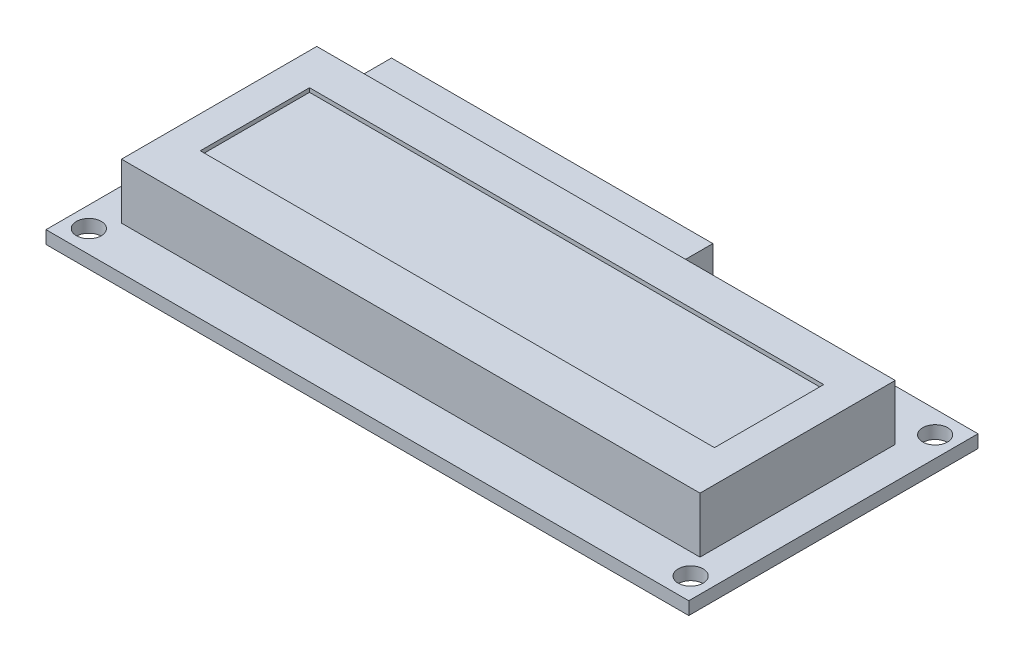
ISO-10303-21;
HEADER;
FILE_DESCRIPTION(('STEP AP214'),'2;1');
FILE_NAME('part.step','',(''),(''),'','','');
FILE_SCHEMA(('AUTOMOTIVE_DESIGN { 1 0 10303 214 1 1 1 1 }'));
ENDSEC;
DATA;
#1=APPLICATION_CONTEXT('core data for automotive mechanical design processes');
#2=APPLICATION_PROTOCOL_DEFINITION('international standard','automotive_design',2000,#1);
#3=PRODUCT_CONTEXT('',#1,'mechanical');
#4=PRODUCT('Part','Part','',(#3));
#5=PRODUCT_RELATED_PRODUCT_CATEGORY('part','',(#4));
#6=PRODUCT_DEFINITION_FORMATION('','',#4);
#7=PRODUCT_DEFINITION_CONTEXT('part definition',#1,'design');
#8=PRODUCT_DEFINITION('design','',#6,#7);
#9=PRODUCT_DEFINITION_SHAPE('','',#8);
#10=(LENGTH_UNIT() NAMED_UNIT(*) SI_UNIT(.MILLI.,.METRE.));
#11=(NAMED_UNIT(*) PLANE_ANGLE_UNIT() SI_UNIT($,.RADIAN.));
#12=(NAMED_UNIT(*) SI_UNIT($,.STERADIAN.) SOLID_ANGLE_UNIT());
#13=UNCERTAINTY_MEASURE_WITH_UNIT(LENGTH_MEASURE(1.E-05),#10,'distance_accuracy_value','');
#14=(GEOMETRIC_REPRESENTATION_CONTEXT(3) GLOBAL_UNCERTAINTY_ASSIGNED_CONTEXT((#13)) GLOBAL_UNIT_ASSIGNED_CONTEXT((#10,
#11,#12)) REPRESENTATION_CONTEXT('',''));
#15=CARTESIAN_POINT('',(0.,0.,0.));
#16=DIRECTION('',(0.,0.,1.));
#17=DIRECTION('',(1.,0.,0.));
#18=AXIS2_PLACEMENT_3D('',#15,#16,#17);
#19=CARTESIAN_POINT('',(0.,0.,0.));
#20=DIRECTION('',(0.,-1.,0.));
#21=DIRECTION('',(0.,0.,-1.));
#22=AXIS2_PLACEMENT_3D('',#19,#20,#21);
#23=PLANE('',#22);
#24=CARTESIAN_POINT('',(-37.45,0.,15.2163222930003));
#25=DIRECTION('',(0.,-1.,0.));
#26=DIRECTION('',(0.,0.,-1.));
#27=AXIS2_PLACEMENT_3D('',#24,#25,#26);
#28=CIRCLE('',#27,1.55);
#29=CARTESIAN_POINT('',(-37.45,0.,13.6663222930003));
#30=VERTEX_POINT('',#29);
#31=EDGE_CURVE('E42',#30,#30,#28,.T.);
#32=ORIENTED_EDGE('',*,*,#31,.F.);
#33=EDGE_LOOP('',(#32));
#34=FACE_BOUND('',#33,.T.);
#35=CARTESIAN_POINT('',(37.45,0.,15.2163222930003));
#36=DIRECTION('',(0.,-1.,0.));
#37=DIRECTION('',(0.,0.,-1.));
#38=AXIS2_PLACEMENT_3D('',#35,#36,#37);
#39=CIRCLE('',#38,1.55);
#40=CARTESIAN_POINT('',(37.45,0.,13.6663222930003));
#41=VERTEX_POINT('',#40);
#42=EDGE_CURVE('E354',#41,#41,#39,.T.);
#43=ORIENTED_EDGE('',*,*,#42,.F.);
#44=EDGE_LOOP('',(#43));
#45=FACE_BOUND('',#44,.T.);
#46=CARTESIAN_POINT('',(37.45,0.,-15.2163222930003));
#47=DIRECTION('',(0.,-1.,0.));
#48=DIRECTION('',(0.,0.,-1.));
#49=AXIS2_PLACEMENT_3D('',#46,#47,#48);
#50=CIRCLE('',#49,1.55);
#51=CARTESIAN_POINT('',(37.45,0.,-16.7663222930003));
#52=VERTEX_POINT('',#51);
#53=EDGE_CURVE('E352',#52,#52,#50,.T.);
#54=ORIENTED_EDGE('',*,*,#53,.F.);
#55=EDGE_LOOP('',(#54));
#56=FACE_BOUND('',#55,.T.);
#57=CARTESIAN_POINT('',(-37.45,0.,-15.2163222930003));
#58=DIRECTION('',(0.,-1.,0.));
#59=DIRECTION('',(0.,0.,-1.));
#60=AXIS2_PLACEMENT_3D('',#57,#58,#59);
#61=CIRCLE('',#60,1.55);
#62=CARTESIAN_POINT('',(-37.45,0.,-16.7663222930003));
#63=VERTEX_POINT('',#62);
#64=EDGE_CURVE('E218',#63,#63,#61,.T.);
#65=ORIENTED_EDGE('',*,*,#64,.F.);
#66=EDGE_LOOP('',(#65));
#67=FACE_BOUND('',#66,.T.);
#68=DIRECTION('',(0.,0.,-1.));
#69=VECTOR('',#68,1.);
#70=CARTESIAN_POINT('',(-33.,0.,0.));
#71=LINE('',#70,#69);
#72=CARTESIAN_POINT('',(-33.,0.,-4.));
#73=VERTEX_POINT('',#72);
#74=CARTESIAN_POINT('',(-33.,0.,-18.));
#75=VERTEX_POINT('',#74);
#76=EDGE_CURVE('E11',#73,#75,#71,.T.);
#77=ORIENTED_EDGE('',*,*,#76,.F.);
#78=DIRECTION('',(-1.,0.,0.));
#79=VECTOR('',#78,1.);
#80=CARTESIAN_POINT('',(-33.,0.,-4.));
#81=LINE('',#80,#79);
#82=CARTESIAN_POINT('',(6.99999999999999,0.,-4.));
#83=VERTEX_POINT('',#82);
#84=EDGE_CURVE('E201',#83,#73,#81,.T.);
#85=ORIENTED_EDGE('',*,*,#84,.F.);
#86=DIRECTION('',(0.,0.,1.));
#87=VECTOR('',#86,1.);
#88=CARTESIAN_POINT('',(7.,0.,0.));
#89=LINE('',#88,#87);
#90=CARTESIAN_POINT('',(6.99999999999999,0.,-18.));
#91=VERTEX_POINT('',#90);
#92=EDGE_CURVE('E47',#91,#83,#89,.T.);
#93=ORIENTED_EDGE('',*,*,#92,.F.);
#94=DIRECTION('',(-1.,0.,0.));
#95=VECTOR('',#94,1.);
#96=CARTESIAN_POINT('',(-40.,0.,-18.));
#97=LINE('',#96,#95);
#98=CARTESIAN_POINT('',(40.,0.,-18.));
#99=VERTEX_POINT('',#98);
#100=EDGE_CURVE('E332',#99,#91,#97,.T.);
#101=ORIENTED_EDGE('',*,*,#100,.F.);
#102=DIRECTION('',(0.,0.,-1.));
#103=VECTOR('',#102,1.);
#104=CARTESIAN_POINT('',(40.,0.,18.));
#105=LINE('',#104,#103);
#106=CARTESIAN_POINT('',(40.,0.,18.));
#107=VERTEX_POINT('',#106);
#108=EDGE_CURVE('E316',#107,#99,#105,.T.);
#109=ORIENTED_EDGE('',*,*,#108,.F.);
#110=DIRECTION('',(1.,0.,0.));
#111=VECTOR('',#110,1.);
#112=CARTESIAN_POINT('',(-40.,0.,18.));
#113=LINE('',#112,#111);
#114=CARTESIAN_POINT('',(-40.,0.,18.));
#115=VERTEX_POINT('',#114);
#116=EDGE_CURVE('E321',#115,#107,#113,.T.);
#117=ORIENTED_EDGE('',*,*,#116,.F.);
#118=DIRECTION('',(0.,0.,1.));
#119=VECTOR('',#118,1.);
#120=CARTESIAN_POINT('',(-40.,0.,18.));
#121=LINE('',#120,#119);
#122=CARTESIAN_POINT('',(-40.,0.,-18.));
#123=VERTEX_POINT('',#122);
#124=EDGE_CURVE('E335',#123,#115,#121,.T.);
#125=ORIENTED_EDGE('',*,*,#124,.F.);
#126=EDGE_CURVE('E63',#75,#123,#97,.T.);
#127=ORIENTED_EDGE('',*,*,#126,.F.);
#128=EDGE_LOOP('',(#77,#85,#93,#101,#109,#117,#125,#127));
#129=FACE_BOUND('',#128,.T.);
#130=ADVANCED_FACE('F38',(#34,#45,#56,#67,#129),#23,.T.);
#131=CARTESIAN_POINT('',(0.,1.6,0.));
#132=DIRECTION('',(0.,-1.,0.));
#133=DIRECTION('',(0.,0.,-1.));
#134=AXIS2_PLACEMENT_3D('',#131,#132,#133);
#135=PLANE('',#134);
#136=CARTESIAN_POINT('',(-37.45,1.6,15.2163222930003));
#137=DIRECTION('',(0.,1.,0.));
#138=DIRECTION('',(0.,0.,-1.));
#139=AXIS2_PLACEMENT_3D('',#136,#137,#138);
#140=CIRCLE('',#139,1.55);
#141=CARTESIAN_POINT('',(-37.45,1.6,13.6663222930003));
#142=VERTEX_POINT('',#141);
#143=EDGE_CURVE('E206',#142,#142,#140,.T.);
#144=ORIENTED_EDGE('',*,*,#143,.F.);
#145=EDGE_LOOP('',(#144));
#146=FACE_BOUND('',#145,.T.);
#147=CARTESIAN_POINT('',(37.45,1.6,15.2163222930003));
#148=DIRECTION('',(0.,1.,0.));
#149=DIRECTION('',(0.,0.,1.));
#150=AXIS2_PLACEMENT_3D('',#147,#148,#149);
#151=CIRCLE('',#150,1.55);
#152=CARTESIAN_POINT('',(37.45,1.6,16.7663222930003));
#153=VERTEX_POINT('',#152);
#154=EDGE_CURVE('E211',#153,#153,#151,.T.);
#155=ORIENTED_EDGE('',*,*,#154,.F.);
#156=EDGE_LOOP('',(#155));
#157=FACE_BOUND('',#156,.T.);
#158=CARTESIAN_POINT('',(37.45,1.6,-15.2163222930003));
#159=DIRECTION('',(0.,1.,0.));
#160=DIRECTION('',(0.,0.,-1.));
#161=AXIS2_PLACEMENT_3D('',#158,#159,#160);
#162=CIRCLE('',#161,1.55);
#163=CARTESIAN_POINT('',(37.45,1.6,-16.7663222930003));
#164=VERTEX_POINT('',#163);
#165=EDGE_CURVE('E207',#164,#164,#162,.T.);
#166=ORIENTED_EDGE('',*,*,#165,.F.);
#167=EDGE_LOOP('',(#166));
#168=FACE_BOUND('',#167,.T.);
#169=CARTESIAN_POINT('',(-37.45,1.6,-15.2163222930003));
#170=DIRECTION('',(0.,1.,0.));
#171=DIRECTION('',(0.,0.,1.));
#172=AXIS2_PLACEMENT_3D('',#169,#170,#171);
#173=CIRCLE('',#172,1.55);
#174=CARTESIAN_POINT('',(-37.45,1.6,-13.6663222930003));
#175=VERTEX_POINT('',#174);
#176=EDGE_CURVE('E210',#175,#175,#173,.T.);
#177=ORIENTED_EDGE('',*,*,#176,.F.);
#178=EDGE_LOOP('',(#177));
#179=FACE_BOUND('',#178,.T.);
#180=DIRECTION('',(-1.,0.,0.));
#181=VECTOR('',#180,1.);
#182=CARTESIAN_POINT('',(0.,1.6,-14.));
#183=LINE('',#182,#181);
#184=CARTESIAN_POINT('',(6.99999999999999,1.6,-14.));
#185=VERTEX_POINT('',#184);
#186=CARTESIAN_POINT('',(-33.,1.6,-14.));
#187=VERTEX_POINT('',#186);
#188=EDGE_CURVE('E234',#185,#187,#183,.T.);
#189=ORIENTED_EDGE('',*,*,#188,.T.);
#190=DIRECTION('',(0.,0.,-1.));
#191=VECTOR('',#190,1.);
#192=CARTESIAN_POINT('',(-33.,1.6,0.));
#193=LINE('',#192,#191);
#194=CARTESIAN_POINT('',(-33.,1.6,-18.));
#195=VERTEX_POINT('',#194);
#196=EDGE_CURVE('E248',#187,#195,#193,.T.);
#197=ORIENTED_EDGE('',*,*,#196,.T.);
#198=DIRECTION('',(-1.,0.,0.));
#199=VECTOR('',#198,1.);
#200=CARTESIAN_POINT('',(-40.,1.6,-18.));
#201=LINE('',#200,#199);
#202=CARTESIAN_POINT('',(-40.,1.6,-18.));
#203=VERTEX_POINT('',#202);
#204=EDGE_CURVE('E320',#195,#203,#201,.T.);
#205=ORIENTED_EDGE('',*,*,#204,.T.);
#206=DIRECTION('',(0.,0.,1.));
#207=VECTOR('',#206,1.);
#208=CARTESIAN_POINT('',(-40.,1.6,18.));
#209=LINE('',#208,#207);
#210=CARTESIAN_POINT('',(-40.,1.6,18.));
#211=VERTEX_POINT('',#210);
#212=EDGE_CURVE('E325',#203,#211,#209,.T.);
#213=ORIENTED_EDGE('',*,*,#212,.T.);
#214=DIRECTION('',(1.,0.,0.));
#215=VECTOR('',#214,1.);
#216=CARTESIAN_POINT('',(-40.,1.6,18.));
#217=LINE('',#216,#215);
#218=CARTESIAN_POINT('',(40.,1.6,18.));
#219=VERTEX_POINT('',#218);
#220=EDGE_CURVE('E327',#211,#219,#217,.T.);
#221=ORIENTED_EDGE('',*,*,#220,.T.);
#222=DIRECTION('',(0.,0.,-1.));
#223=VECTOR('',#222,1.);
#224=CARTESIAN_POINT('',(40.,1.6,18.));
#225=LINE('',#224,#223);
#226=CARTESIAN_POINT('',(40.,1.6,-18.));
#227=VERTEX_POINT('',#226);
#228=EDGE_CURVE('E317',#219,#227,#225,.T.);
#229=ORIENTED_EDGE('',*,*,#228,.T.);
#230=CARTESIAN_POINT('',(6.99999999999999,1.6,-18.));
#231=VERTEX_POINT('',#230);
#232=EDGE_CURVE('E322',#227,#231,#201,.T.);
#233=ORIENTED_EDGE('',*,*,#232,.T.);
#234=DIRECTION('',(0.,0.,1.));
#235=VECTOR('',#234,1.);
#236=CARTESIAN_POINT('',(7.,1.6,0.));
#237=LINE('',#236,#235);
#238=EDGE_CURVE('E245',#231,#185,#237,.T.);
#239=ORIENTED_EDGE('',*,*,#238,.T.);
#240=EDGE_LOOP('',(#189,#197,#205,#213,#221,#229,#233,#239));
#241=FACE_BOUND('',#240,.T.);
#242=DIRECTION('',(0.,0.,-1.));
#243=VECTOR('',#242,1.);
#244=CARTESIAN_POINT('',(36.,1.6,12.6));
#245=LINE('',#244,#243);
#246=CARTESIAN_POINT('',(36.,1.6,12.6));
#247=VERTEX_POINT('',#246);
#248=CARTESIAN_POINT('',(36.,1.6,-11.7));
#249=VERTEX_POINT('',#248);
#250=EDGE_CURVE('E277',#247,#249,#245,.T.);
#251=ORIENTED_EDGE('',*,*,#250,.F.);
#252=DIRECTION('',(1.,0.,0.));
#253=VECTOR('',#252,1.);
#254=CARTESIAN_POINT('',(-36.,1.6,12.6));
#255=LINE('',#254,#253);
#256=CARTESIAN_POINT('',(-36.,1.6,12.6));
#257=VERTEX_POINT('',#256);
#258=EDGE_CURVE('E288',#257,#247,#255,.T.);
#259=ORIENTED_EDGE('',*,*,#258,.F.);
#260=DIRECTION('',(0.,0.,1.));
#261=VECTOR('',#260,1.);
#262=CARTESIAN_POINT('',(-36.,1.6,12.6));
#263=LINE('',#262,#261);
#264=CARTESIAN_POINT('',(-36.,1.6,-11.7));
#265=VERTEX_POINT('',#264);
#266=EDGE_CURVE('E300',#265,#257,#263,.T.);
#267=ORIENTED_EDGE('',*,*,#266,.F.);
#268=DIRECTION('',(-1.,0.,0.));
#269=VECTOR('',#268,1.);
#270=CARTESIAN_POINT('',(-36.,1.6,-11.7));
#271=LINE('',#270,#269);
#272=EDGE_CURVE('E297',#249,#265,#271,.T.);
#273=ORIENTED_EDGE('',*,*,#272,.F.);
#274=EDGE_LOOP('',(#251,#259,#267,#273));
#275=FACE_BOUND('',#274,.T.);
#276=ADVANCED_FACE('F366',(#146,#157,#168,#179,#241,#275),#135,.F.);
#277=CARTESIAN_POINT('',(40.,1.6,18.));
#278=DIRECTION('',(-1.,0.,0.));
#279=DIRECTION('',(0.,0.,1.));
#280=AXIS2_PLACEMENT_3D('',#277,#278,#279);
#281=PLANE('',#280);
#282=ORIENTED_EDGE('',*,*,#108,.T.);
#283=DIRECTION('',(0.,-1.,0.));
#284=VECTOR('',#283,1.);
#285=CARTESIAN_POINT('',(40.,1.6,-18.));
#286=LINE('',#285,#284);
#287=EDGE_CURVE('E346',#227,#99,#286,.T.);
#288=ORIENTED_EDGE('',*,*,#287,.F.);
#289=ORIENTED_EDGE('',*,*,#228,.F.);
#290=DIRECTION('',(0.,-1.,0.));
#291=VECTOR('',#290,1.);
#292=CARTESIAN_POINT('',(40.,1.6,18.));
#293=LINE('',#292,#291);
#294=EDGE_CURVE('E329',#219,#107,#293,.T.);
#295=ORIENTED_EDGE('',*,*,#294,.T.);
#296=EDGE_LOOP('',(#282,#288,#289,#295));
#297=FACE_BOUND('',#296,.T.);
#298=ADVANCED_FACE('F40',(#297),#281,.F.);
#299=CARTESIAN_POINT('',(-40.,1.6,-18.));
#300=DIRECTION('',(0.,0.,1.));
#301=DIRECTION('',(1.,0.,0.));
#302=AXIS2_PLACEMENT_3D('',#299,#300,#301);
#303=PLANE('',#302);
#304=ORIENTED_EDGE('',*,*,#100,.T.);
#305=DIRECTION('',(0.,1.,0.));
#306=VECTOR('',#305,1.);
#307=CARTESIAN_POINT('',(6.99999999999999,-5.4,-18.));
#308=LINE('',#307,#306);
#309=CARTESIAN_POINT('',(6.99999999999999,-5.4,-18.));
#310=VERTEX_POINT('',#309);
#311=EDGE_CURVE('E236',#310,#91,#308,.T.);
#312=ORIENTED_EDGE('',*,*,#311,.F.);
#313=DIRECTION('',(-1.,0.,0.));
#314=VECTOR('',#313,1.);
#315=CARTESIAN_POINT('',(-33.,-5.4,-18.));
#316=LINE('',#315,#314);
#317=CARTESIAN_POINT('',(-33.,-5.4,-18.));
#318=VERTEX_POINT('',#317);
#319=EDGE_CURVE('E231',#310,#318,#316,.T.);
#320=ORIENTED_EDGE('',*,*,#319,.T.);
#321=DIRECTION('',(0.,1.,0.));
#322=VECTOR('',#321,1.);
#323=CARTESIAN_POINT('',(-33.,-5.4,-18.));
#324=LINE('',#323,#322);
#325=EDGE_CURVE('E182',#318,#75,#324,.T.);
#326=ORIENTED_EDGE('',*,*,#325,.T.);
#327=ORIENTED_EDGE('',*,*,#126,.T.);
#328=DIRECTION('',(0.,-1.,0.));
#329=VECTOR('',#328,1.);
#330=CARTESIAN_POINT('',(-40.,1.6,-18.));
#331=LINE('',#330,#329);
#332=EDGE_CURVE('E343',#203,#123,#331,.T.);
#333=ORIENTED_EDGE('',*,*,#332,.F.);
#334=ORIENTED_EDGE('',*,*,#204,.F.);
#335=CARTESIAN_POINT('',(-33.,5.6,-18.));
#336=VERTEX_POINT('',#335);
#337=EDGE_CURVE('E235',#195,#336,#324,.T.);
#338=ORIENTED_EDGE('',*,*,#337,.T.);
#339=DIRECTION('',(-1.,0.,0.));
#340=VECTOR('',#339,1.);
#341=CARTESIAN_POINT('',(-33.,5.6,-18.));
#342=LINE('',#341,#340);
#343=CARTESIAN_POINT('',(6.99999999999999,5.6,-18.));
#344=VERTEX_POINT('',#343);
#345=EDGE_CURVE('E187',#344,#336,#342,.T.);
#346=ORIENTED_EDGE('',*,*,#345,.F.);
#347=EDGE_CURVE('E239',#231,#344,#308,.T.);
#348=ORIENTED_EDGE('',*,*,#347,.F.);
#349=ORIENTED_EDGE('',*,*,#232,.F.);
#350=ORIENTED_EDGE('',*,*,#287,.T.);
#351=EDGE_LOOP('',(#304,#312,#320,#326,#327,#333,#334,#338,#346,#348,#349,#350));
#352=FACE_BOUND('',#351,.T.);
#353=ADVANCED_FACE('F373',(#352),#303,.F.);
#354=CARTESIAN_POINT('',(-40.,1.6,18.));
#355=DIRECTION('',(1.,0.,0.));
#356=DIRECTION('',(0.,0.,-1.));
#357=AXIS2_PLACEMENT_3D('',#354,#355,#356);
#358=PLANE('',#357);
#359=ORIENTED_EDGE('',*,*,#124,.T.);
#360=DIRECTION('',(0.,-1.,0.));
#361=VECTOR('',#360,1.);
#362=CARTESIAN_POINT('',(-40.,1.6,18.));
#363=LINE('',#362,#361);
#364=EDGE_CURVE('E340',#211,#115,#363,.T.);
#365=ORIENTED_EDGE('',*,*,#364,.F.);
#366=ORIENTED_EDGE('',*,*,#212,.F.);
#367=ORIENTED_EDGE('',*,*,#332,.T.);
#368=EDGE_LOOP('',(#359,#365,#366,#367));
#369=FACE_BOUND('',#368,.T.);
#370=ADVANCED_FACE('F389',(#369),#358,.F.);
#371=CARTESIAN_POINT('',(-40.,1.6,18.));
#372=DIRECTION('',(0.,0.,-1.));
#373=DIRECTION('',(-1.,0.,0.));
#374=AXIS2_PLACEMENT_3D('',#371,#372,#373);
#375=PLANE('',#374);
#376=ORIENTED_EDGE('',*,*,#116,.T.);
#377=ORIENTED_EDGE('',*,*,#294,.F.);
#378=ORIENTED_EDGE('',*,*,#220,.F.);
#379=ORIENTED_EDGE('',*,*,#364,.T.);
#380=EDGE_LOOP('',(#376,#377,#378,#379));
#381=FACE_BOUND('',#380,.T.);
#382=ADVANCED_FACE('F386',(#381),#375,.F.);
#383=CARTESIAN_POINT('',(36.,8.5,12.6));
#384=DIRECTION('',(-1.,0.,0.));
#385=DIRECTION('',(0.,0.,1.));
#386=AXIS2_PLACEMENT_3D('',#383,#384,#385);
#387=PLANE('',#386);
#388=ORIENTED_EDGE('',*,*,#250,.T.);
#389=DIRECTION('',(0.,-1.,0.));
#390=VECTOR('',#389,1.);
#391=CARTESIAN_POINT('',(36.,8.5,-11.7));
#392=LINE('',#391,#390);
#393=CARTESIAN_POINT('',(36.,8.5,-11.7));
#394=VERTEX_POINT('',#393);
#395=EDGE_CURVE('E313',#394,#249,#392,.T.);
#396=ORIENTED_EDGE('',*,*,#395,.F.);
#397=DIRECTION('',(0.,0.,-1.));
#398=VECTOR('',#397,1.);
#399=CARTESIAN_POINT('',(36.,8.5,12.6));
#400=LINE('',#399,#398);
#401=CARTESIAN_POINT('',(36.,8.5,12.6));
#402=VERTEX_POINT('',#401);
#403=EDGE_CURVE('E284',#402,#394,#400,.T.);
#404=ORIENTED_EDGE('',*,*,#403,.F.);
#405=DIRECTION('',(0.,-1.,0.));
#406=VECTOR('',#405,1.);
#407=CARTESIAN_POINT('',(36.,8.5,12.6));
#408=LINE('',#407,#406);
#409=EDGE_CURVE('E294',#402,#247,#408,.T.);
#410=ORIENTED_EDGE('',*,*,#409,.T.);
#411=EDGE_LOOP('',(#388,#396,#404,#410));
#412=FACE_BOUND('',#411,.T.);
#413=ADVANCED_FACE('F453',(#412),#387,.F.);
#414=CARTESIAN_POINT('',(-36.,8.5,-11.7));
#415=DIRECTION('',(0.,0.,1.));
#416=DIRECTION('',(1.,0.,0.));
#417=AXIS2_PLACEMENT_3D('',#414,#415,#416);
#418=PLANE('',#417);
#419=ORIENTED_EDGE('',*,*,#272,.T.);
#420=DIRECTION('',(0.,-1.,0.));
#421=VECTOR('',#420,1.);
#422=CARTESIAN_POINT('',(-36.,8.5,-11.7));
#423=LINE('',#422,#421);
#424=CARTESIAN_POINT('',(-36.,8.5,-11.7));
#425=VERTEX_POINT('',#424);
#426=EDGE_CURVE('E310',#425,#265,#423,.T.);
#427=ORIENTED_EDGE('',*,*,#426,.F.);
#428=DIRECTION('',(-1.,0.,0.));
#429=VECTOR('',#428,1.);
#430=CARTESIAN_POINT('',(-36.,8.5,-11.7));
#431=LINE('',#430,#429);
#432=EDGE_CURVE('E287',#394,#425,#431,.T.);
#433=ORIENTED_EDGE('',*,*,#432,.F.);
#434=ORIENTED_EDGE('',*,*,#395,.T.);
#435=EDGE_LOOP('',(#419,#427,#433,#434));
#436=FACE_BOUND('',#435,.T.);
#437=ADVANCED_FACE('F449',(#436),#418,.F.);
#438=CARTESIAN_POINT('',(-36.,8.5,12.6));
#439=DIRECTION('',(1.,0.,0.));
#440=DIRECTION('',(0.,0.,-1.));
#441=AXIS2_PLACEMENT_3D('',#438,#439,#440);
#442=PLANE('',#441);
#443=ORIENTED_EDGE('',*,*,#266,.T.);
#444=DIRECTION('',(0.,-1.,0.));
#445=VECTOR('',#444,1.);
#446=CARTESIAN_POINT('',(-36.,8.5,12.6));
#447=LINE('',#446,#445);
#448=CARTESIAN_POINT('',(-36.,8.5,12.6));
#449=VERTEX_POINT('',#448);
#450=EDGE_CURVE('E307',#449,#257,#447,.T.);
#451=ORIENTED_EDGE('',*,*,#450,.F.);
#452=DIRECTION('',(0.,0.,1.));
#453=VECTOR('',#452,1.);
#454=CARTESIAN_POINT('',(-36.,8.5,12.6));
#455=LINE('',#454,#453);
#456=EDGE_CURVE('E290',#425,#449,#455,.T.);
#457=ORIENTED_EDGE('',*,*,#456,.F.);
#458=ORIENTED_EDGE('',*,*,#426,.T.);
#459=EDGE_LOOP('',(#443,#451,#457,#458));
#460=FACE_BOUND('',#459,.T.);
#461=ADVANCED_FACE('F445',(#460),#442,.F.);
#462=CARTESIAN_POINT('',(-36.,8.5,12.6));
#463=DIRECTION('',(0.,0.,-1.));
#464=DIRECTION('',(-1.,0.,0.));
#465=AXIS2_PLACEMENT_3D('',#462,#463,#464);
#466=PLANE('',#465);
#467=ORIENTED_EDGE('',*,*,#258,.T.);
#468=ORIENTED_EDGE('',*,*,#409,.F.);
#469=DIRECTION('',(1.,0.,0.));
#470=VECTOR('',#469,1.);
#471=CARTESIAN_POINT('',(-36.,8.5,12.6));
#472=LINE('',#471,#470);
#473=EDGE_CURVE('E292',#449,#402,#472,.T.);
#474=ORIENTED_EDGE('',*,*,#473,.F.);
#475=ORIENTED_EDGE('',*,*,#450,.T.);
#476=EDGE_LOOP('',(#467,#468,#474,#475));
#477=FACE_BOUND('',#476,.T.);
#478=ADVANCED_FACE('F441',(#477),#466,.F.);
#479=CARTESIAN_POINT('',(0.,8.5,0.));
#480=DIRECTION('',(0.,-1.,0.));
#481=DIRECTION('',(0.,0.,-1.));
#482=AXIS2_PLACEMENT_3D('',#479,#480,#481);
#483=PLANE('',#482);
#484=DIRECTION('',(-1.,0.,0.));
#485=VECTOR('',#484,1.);
#486=CARTESIAN_POINT('',(-32.,8.5,-6.8));
#487=LINE('',#486,#485);
#488=CARTESIAN_POINT('',(32.,8.5,-6.8));
#489=VERTEX_POINT('',#488);
#490=CARTESIAN_POINT('',(-32.,8.5,-6.8));
#491=VERTEX_POINT('',#490);
#492=EDGE_CURVE('E267',#489,#491,#487,.T.);
#493=ORIENTED_EDGE('',*,*,#492,.F.);
#494=DIRECTION('',(0.,0.,-1.));
#495=VECTOR('',#494,1.);
#496=CARTESIAN_POINT('',(32.,8.5,6.8));
#497=LINE('',#496,#495);
#498=CARTESIAN_POINT('',(32.,8.5,6.8));
#499=VERTEX_POINT('',#498);
#500=EDGE_CURVE('E251',#499,#489,#497,.T.);
#501=ORIENTED_EDGE('',*,*,#500,.F.);
#502=DIRECTION('',(1.,0.,0.));
#503=VECTOR('',#502,1.);
#504=CARTESIAN_POINT('',(-32.,8.5,6.8));
#505=LINE('',#504,#503);
#506=CARTESIAN_POINT('',(-32.,8.5,6.8));
#507=VERTEX_POINT('',#506);
#508=EDGE_CURVE('E256',#507,#499,#505,.T.);
#509=ORIENTED_EDGE('',*,*,#508,.F.);
#510=DIRECTION('',(0.,0.,1.));
#511=VECTOR('',#510,1.);
#512=CARTESIAN_POINT('',(-32.,8.5,6.8));
#513=LINE('',#512,#511);
#514=EDGE_CURVE('E270',#491,#507,#513,.T.);
#515=ORIENTED_EDGE('',*,*,#514,.F.);
#516=EDGE_LOOP('',(#493,#501,#509,#515));
#517=FACE_BOUND('',#516,.T.);
#518=ORIENTED_EDGE('',*,*,#403,.T.);
#519=ORIENTED_EDGE('',*,*,#432,.T.);
#520=ORIENTED_EDGE('',*,*,#456,.T.);
#521=ORIENTED_EDGE('',*,*,#473,.T.);
#522=EDGE_LOOP('',(#518,#519,#520,#521));
#523=FACE_BOUND('',#522,.T.);
#524=ADVANCED_FACE('F437',(#517,#523),#483,.F.);
#525=CARTESIAN_POINT('',(32.,8.,6.8));
#526=DIRECTION('',(1.,0.,0.));
#527=DIRECTION('',(0.,0.,-1.));
#528=AXIS2_PLACEMENT_3D('',#525,#526,#527);
#529=PLANE('',#528);
#530=ORIENTED_EDGE('',*,*,#500,.T.);
#531=DIRECTION('',(0.,1.,0.));
#532=VECTOR('',#531,1.);
#533=CARTESIAN_POINT('',(32.,8.,-6.8));
#534=LINE('',#533,#532);
#535=CARTESIAN_POINT('',(32.,8.,-6.8));
#536=VERTEX_POINT('',#535);
#537=EDGE_CURVE('E265',#536,#489,#534,.T.);
#538=ORIENTED_EDGE('',*,*,#537,.F.);
#539=DIRECTION('',(0.,0.,-1.));
#540=VECTOR('',#539,1.);
#541=CARTESIAN_POINT('',(32.,8.,6.8));
#542=LINE('',#541,#540);
#543=CARTESIAN_POINT('',(32.,8.,6.8));
#544=VERTEX_POINT('',#543);
#545=EDGE_CURVE('E252',#544,#536,#542,.T.);
#546=ORIENTED_EDGE('',*,*,#545,.F.);
#547=DIRECTION('',(0.,1.,0.));
#548=VECTOR('',#547,1.);
#549=CARTESIAN_POINT('',(32.,8.,6.8));
#550=LINE('',#549,#548);
#551=EDGE_CURVE('E275',#544,#499,#550,.T.);
#552=ORIENTED_EDGE('',*,*,#551,.T.);
#553=EDGE_LOOP('',(#530,#538,#546,#552));
#554=FACE_BOUND('',#553,.T.);
#555=ADVANCED_FACE('F427',(#554),#529,.F.);
#556=CARTESIAN_POINT('',(-32.,8.,6.8));
#557=DIRECTION('',(0.,0.,1.));
#558=DIRECTION('',(1.,0.,0.));
#559=AXIS2_PLACEMENT_3D('',#556,#557,#558);
#560=PLANE('',#559);
#561=ORIENTED_EDGE('',*,*,#508,.T.);
#562=ORIENTED_EDGE('',*,*,#551,.F.);
#563=DIRECTION('',(1.,0.,0.));
#564=VECTOR('',#563,1.);
#565=CARTESIAN_POINT('',(-32.,8.,6.8));
#566=LINE('',#565,#564);
#567=CARTESIAN_POINT('',(-32.,8.,6.8));
#568=VERTEX_POINT('',#567);
#569=EDGE_CURVE('E262',#568,#544,#566,.T.);
#570=ORIENTED_EDGE('',*,*,#569,.F.);
#571=DIRECTION('',(0.,1.,0.));
#572=VECTOR('',#571,1.);
#573=CARTESIAN_POINT('',(-32.,8.,6.8));
#574=LINE('',#573,#572);
#575=EDGE_CURVE('E278',#568,#507,#574,.T.);
#576=ORIENTED_EDGE('',*,*,#575,.T.);
#577=EDGE_LOOP('',(#561,#562,#570,#576));
#578=FACE_BOUND('',#577,.T.);
#579=ADVANCED_FACE('F423',(#578),#560,.F.);
#580=CARTESIAN_POINT('',(-32.,8.,6.8));
#581=DIRECTION('',(-1.,0.,0.));
#582=DIRECTION('',(0.,0.,1.));
#583=AXIS2_PLACEMENT_3D('',#580,#581,#582);
#584=PLANE('',#583);
#585=ORIENTED_EDGE('',*,*,#514,.T.);
#586=ORIENTED_EDGE('',*,*,#575,.F.);
#587=DIRECTION('',(0.,0.,1.));
#588=VECTOR('',#587,1.);
#589=CARTESIAN_POINT('',(-32.,8.,6.8));
#590=LINE('',#589,#588);
#591=CARTESIAN_POINT('',(-32.,8.,-6.8));
#592=VERTEX_POINT('',#591);
#593=EDGE_CURVE('E259',#592,#568,#590,.T.);
#594=ORIENTED_EDGE('',*,*,#593,.F.);
#595=DIRECTION('',(0.,1.,0.));
#596=VECTOR('',#595,1.);
#597=CARTESIAN_POINT('',(-32.,8.,-6.8));
#598=LINE('',#597,#596);
#599=EDGE_CURVE('E280',#592,#491,#598,.T.);
#600=ORIENTED_EDGE('',*,*,#599,.T.);
#601=EDGE_LOOP('',(#585,#586,#594,#600));
#602=FACE_BOUND('',#601,.T.);
#603=ADVANCED_FACE('F426',(#602),#584,.F.);
#604=CARTESIAN_POINT('',(-32.,8.,-6.8));
#605=DIRECTION('',(0.,0.,-1.));
#606=DIRECTION('',(-1.,0.,0.));
#607=AXIS2_PLACEMENT_3D('',#604,#605,#606);
#608=PLANE('',#607);
#609=ORIENTED_EDGE('',*,*,#492,.T.);
#610=ORIENTED_EDGE('',*,*,#599,.F.);
#611=DIRECTION('',(-1.,0.,0.));
#612=VECTOR('',#611,1.);
#613=CARTESIAN_POINT('',(-32.,8.,-6.8));
#614=LINE('',#613,#612);
#615=EDGE_CURVE('E255',#536,#592,#614,.T.);
#616=ORIENTED_EDGE('',*,*,#615,.F.);
#617=ORIENTED_EDGE('',*,*,#537,.T.);
#618=EDGE_LOOP('',(#609,#610,#616,#617));
#619=FACE_BOUND('',#618,.T.);
#620=ADVANCED_FACE('F421',(#619),#608,.F.);
#621=CARTESIAN_POINT('',(0.,8.,0.));
#622=DIRECTION('',(0.,-1.,0.));
#623=DIRECTION('',(0.,0.,-1.));
#624=AXIS2_PLACEMENT_3D('',#621,#622,#623);
#625=PLANE('',#624);
#626=ORIENTED_EDGE('',*,*,#545,.T.);
#627=ORIENTED_EDGE('',*,*,#615,.T.);
#628=ORIENTED_EDGE('',*,*,#593,.T.);
#629=ORIENTED_EDGE('',*,*,#569,.T.);
#630=EDGE_LOOP('',(#626,#627,#628,#629));
#631=FACE_BOUND('',#630,.T.);
#632=ADVANCED_FACE('F418',(#631),#625,.F.);
#633=CARTESIAN_POINT('',(0.,-5.4,0.));
#634=DIRECTION('',(0.,1.,0.));
#635=DIRECTION('',(0.,0.,1.));
#636=AXIS2_PLACEMENT_3D('',#633,#634,#635);
#637=PLANE('',#636);
#638=DIRECTION('',(0.,0.,1.));
#639=VECTOR('',#638,1.);
#640=CARTESIAN_POINT('',(-33.,-5.4,-18.));
#641=LINE('',#640,#639);
#642=CARTESIAN_POINT('',(-33.,-5.4,-4.));
#643=VERTEX_POINT('',#642);
#644=EDGE_CURVE('E176',#318,#643,#641,.T.);
#645=ORIENTED_EDGE('',*,*,#644,.F.);
#646=ORIENTED_EDGE('',*,*,#319,.F.);
#647=DIRECTION('',(0.,0.,-1.));
#648=VECTOR('',#647,1.);
#649=CARTESIAN_POINT('',(6.99999999999999,-5.4,-18.));
#650=LINE('',#649,#648);
#651=CARTESIAN_POINT('',(6.99999999999999,-5.4,-4.));
#652=VERTEX_POINT('',#651);
#653=EDGE_CURVE('E186',#652,#310,#650,.T.);
#654=ORIENTED_EDGE('',*,*,#653,.F.);
#655=DIRECTION('',(1.,0.,0.));
#656=VECTOR('',#655,1.);
#657=CARTESIAN_POINT('',(-33.,-5.4,-4.));
#658=LINE('',#657,#656);
#659=EDGE_CURVE('E190',#643,#652,#658,.T.);
#660=ORIENTED_EDGE('',*,*,#659,.F.);
#661=EDGE_LOOP('',(#645,#646,#654,#660));
#662=FACE_BOUND('',#661,.T.);
#663=ADVANCED_FACE('F191',(#662),#637,.F.);
#664=CARTESIAN_POINT('',(6.99999999999999,-5.4,-18.));
#665=DIRECTION('',(1.,0.,0.));
#666=DIRECTION('',(0.,0.,-1.));
#667=AXIS2_PLACEMENT_3D('',#664,#665,#666);
#668=PLANE('',#667);
#669=ORIENTED_EDGE('',*,*,#311,.T.);
#670=ORIENTED_EDGE('',*,*,#92,.T.);
#671=DIRECTION('',(0.,1.,0.));
#672=VECTOR('',#671,1.);
#673=CARTESIAN_POINT('',(6.99999999999999,0.,-4.));
#674=LINE('',#673,#672);
#675=EDGE_CURVE('E196',#652,#83,#674,.T.);
#676=ORIENTED_EDGE('',*,*,#675,.F.);
#677=ORIENTED_EDGE('',*,*,#653,.T.);
#678=EDGE_LOOP('',(#669,#670,#676,#677));
#679=FACE_BOUND('',#678,.T.);
#680=ADVANCED_FACE('F376',(#679),#668,.T.);
#681=CARTESIAN_POINT('',(-33.,-5.4,-18.));
#682=DIRECTION('',(-1.,0.,0.));
#683=DIRECTION('',(0.,0.,1.));
#684=AXIS2_PLACEMENT_3D('',#681,#682,#683);
#685=PLANE('',#684);
#686=ORIENTED_EDGE('',*,*,#644,.T.);
#687=DIRECTION('',(0.,-1.,0.));
#688=VECTOR('',#687,1.);
#689=CARTESIAN_POINT('',(-33.,0.,-4.));
#690=LINE('',#689,#688);
#691=EDGE_CURVE('E180',#73,#643,#690,.T.);
#692=ORIENTED_EDGE('',*,*,#691,.F.);
#693=ORIENTED_EDGE('',*,*,#76,.T.);
#694=ORIENTED_EDGE('',*,*,#325,.F.);
#695=EDGE_LOOP('',(#686,#692,#693,#694));
#696=FACE_BOUND('',#695,.T.);
#697=ADVANCED_FACE('F178',(#696),#685,.T.);
#698=ORIENTED_EDGE('',*,*,#196,.F.);
#699=DIRECTION('',(0.,1.,0.));
#700=VECTOR('',#699,1.);
#701=CARTESIAN_POINT('',(-33.,-5.4,-14.));
#702=LINE('',#701,#700);
#703=CARTESIAN_POINT('',(-33.,5.6,-14.));
#704=VERTEX_POINT('',#703);
#705=EDGE_CURVE('E55',#187,#704,#702,.T.);
#706=ORIENTED_EDGE('',*,*,#705,.T.);
#707=DIRECTION('',(0.,0.,1.));
#708=VECTOR('',#707,1.);
#709=CARTESIAN_POINT('',(-33.,5.6,-18.));
#710=LINE('',#709,#708);
#711=EDGE_CURVE('E219',#336,#704,#710,.T.);
#712=ORIENTED_EDGE('',*,*,#711,.F.);
#713=ORIENTED_EDGE('',*,*,#337,.F.);
#714=EDGE_LOOP('',(#698,#706,#712,#713));
#715=FACE_BOUND('',#714,.T.);
#716=ADVANCED_FACE('F396',(#715),#685,.T.);
#717=ORIENTED_EDGE('',*,*,#238,.F.);
#718=ORIENTED_EDGE('',*,*,#347,.T.);
#719=DIRECTION('',(0.,0.,-1.));
#720=VECTOR('',#719,1.);
#721=CARTESIAN_POINT('',(6.99999999999999,5.6,-18.));
#722=LINE('',#721,#720);
#723=CARTESIAN_POINT('',(6.99999999999999,5.6,-14.));
#724=VERTEX_POINT('',#723);
#725=EDGE_CURVE('E225',#724,#344,#722,.T.);
#726=ORIENTED_EDGE('',*,*,#725,.F.);
#727=DIRECTION('',(0.,1.,0.));
#728=VECTOR('',#727,1.);
#729=CARTESIAN_POINT('',(6.99999999999999,-5.4,-14.));
#730=LINE('',#729,#728);
#731=EDGE_CURVE('E240',#185,#724,#730,.T.);
#732=ORIENTED_EDGE('',*,*,#731,.F.);
#733=EDGE_LOOP('',(#717,#718,#726,#732));
#734=FACE_BOUND('',#733,.T.);
#735=ADVANCED_FACE('F403',(#734),#668,.T.);
#736=CARTESIAN_POINT('',(-33.,-5.4,-14.));
#737=DIRECTION('',(0.,0.,1.));
#738=DIRECTION('',(1.,0.,0.));
#739=AXIS2_PLACEMENT_3D('',#736,#737,#738);
#740=PLANE('',#739);
#741=ORIENTED_EDGE('',*,*,#188,.F.);
#742=ORIENTED_EDGE('',*,*,#731,.T.);
#743=DIRECTION('',(1.,0.,0.));
#744=VECTOR('',#743,1.);
#745=CARTESIAN_POINT('',(-33.,5.6,-14.));
#746=LINE('',#745,#744);
#747=EDGE_CURVE('E222',#704,#724,#746,.T.);
#748=ORIENTED_EDGE('',*,*,#747,.F.);
#749=ORIENTED_EDGE('',*,*,#705,.F.);
#750=EDGE_LOOP('',(#741,#742,#748,#749));
#751=FACE_BOUND('',#750,.T.);
#752=ADVANCED_FACE('F404',(#751),#740,.T.);
#753=CARTESIAN_POINT('',(0.,5.6,0.));
#754=DIRECTION('',(0.,1.,0.));
#755=DIRECTION('',(0.,0.,1.));
#756=AXIS2_PLACEMENT_3D('',#753,#754,#755);
#757=PLANE('',#756);
#758=ORIENTED_EDGE('',*,*,#711,.T.);
#759=ORIENTED_EDGE('',*,*,#747,.T.);
#760=ORIENTED_EDGE('',*,*,#725,.T.);
#761=ORIENTED_EDGE('',*,*,#345,.T.);
#762=EDGE_LOOP('',(#758,#759,#760,#761));
#763=FACE_BOUND('',#762,.T.);
#764=ADVANCED_FACE('F399',(#763),#757,.T.);
#765=CARTESIAN_POINT('',(-37.45,-5.4,-15.2163222930003));
#766=DIRECTION('',(0.,1.,0.));
#767=DIRECTION('',(0.,0.,1.));
#768=AXIS2_PLACEMENT_3D('',#765,#766,#767);
#769=CYLINDRICAL_SURFACE('',#768,1.55);
#770=ORIENTED_EDGE('',*,*,#64,.T.);
#771=EDGE_LOOP('',(#770));
#772=FACE_BOUND('',#771,.T.);
#773=ORIENTED_EDGE('',*,*,#176,.T.);
#774=EDGE_LOOP('',(#773));
#775=FACE_BOUND('',#774,.T.);
#776=ADVANCED_FACE('F411',(#772,#775),#769,.F.);
#777=CARTESIAN_POINT('',(37.45,-5.4,-15.2163222930003));
#778=DIRECTION('',(0.,1.,0.));
#779=DIRECTION('',(0.,0.,1.));
#780=AXIS2_PLACEMENT_3D('',#777,#778,#779);
#781=CYLINDRICAL_SURFACE('',#780,1.55);
#782=ORIENTED_EDGE('',*,*,#53,.T.);
#783=EDGE_LOOP('',(#782));
#784=FACE_BOUND('',#783,.T.);
#785=ORIENTED_EDGE('',*,*,#165,.T.);
#786=EDGE_LOOP('',(#785));
#787=FACE_BOUND('',#786,.T.);
#788=ADVANCED_FACE('F532',(#784,#787),#781,.F.);
#789=CARTESIAN_POINT('',(37.45,-5.4,15.2163222930003));
#790=DIRECTION('',(0.,1.,0.));
#791=DIRECTION('',(0.,0.,1.));
#792=AXIS2_PLACEMENT_3D('',#789,#790,#791);
#793=CYLINDRICAL_SURFACE('',#792,1.55);
#794=ORIENTED_EDGE('',*,*,#42,.T.);
#795=EDGE_LOOP('',(#794));
#796=FACE_BOUND('',#795,.T.);
#797=ORIENTED_EDGE('',*,*,#154,.T.);
#798=EDGE_LOOP('',(#797));
#799=FACE_BOUND('',#798,.T.);
#800=ADVANCED_FACE('F528',(#796,#799),#793,.F.);
#801=CARTESIAN_POINT('',(-37.45,-5.4,15.2163222930003));
#802=DIRECTION('',(0.,1.,0.));
#803=DIRECTION('',(0.,0.,1.));
#804=AXIS2_PLACEMENT_3D('',#801,#802,#803);
#805=CYLINDRICAL_SURFACE('',#804,1.55);
#806=ORIENTED_EDGE('',*,*,#31,.T.);
#807=EDGE_LOOP('',(#806));
#808=FACE_BOUND('',#807,.T.);
#809=ORIENTED_EDGE('',*,*,#143,.T.);
#810=EDGE_LOOP('',(#809));
#811=FACE_BOUND('',#810,.T.);
#812=ADVANCED_FACE('F361',(#808,#811),#805,.F.);
#813=CARTESIAN_POINT('',(0.,0.,-4.));
#814=DIRECTION('',(0.,0.,1.));
#815=DIRECTION('',(1.,0.,0.));
#816=AXIS2_PLACEMENT_3D('',#813,#814,#815);
#817=PLANE('',#816);
#818=ORIENTED_EDGE('',*,*,#691,.T.);
#819=ORIENTED_EDGE('',*,*,#659,.T.);
#820=ORIENTED_EDGE('',*,*,#675,.T.);
#821=ORIENTED_EDGE('',*,*,#84,.T.);
#822=EDGE_LOOP('',(#818,#819,#820,#821));
#823=FACE_BOUND('',#822,.T.);
#824=ADVANCED_FACE('F199',(#823),#817,.T.);
#825=CLOSED_SHELL('',(#130,#276,#298,#353,#370,#382,#413,#437,#461,#478,#524,#555,#579,#603,
#620,#632,#663,#680,#697,#716,#735,#752,#764,#776,#788,#800,#812,#824));
#826=MANIFOLD_SOLID_BREP('B2',#825);
#827=ADVANCED_BREP_SHAPE_REPRESENTATION('',(#18,#826),#14);
#828=SHAPE_DEFINITION_REPRESENTATION(#9,#827);
ENDSEC;
END-ISO-10303-21;
